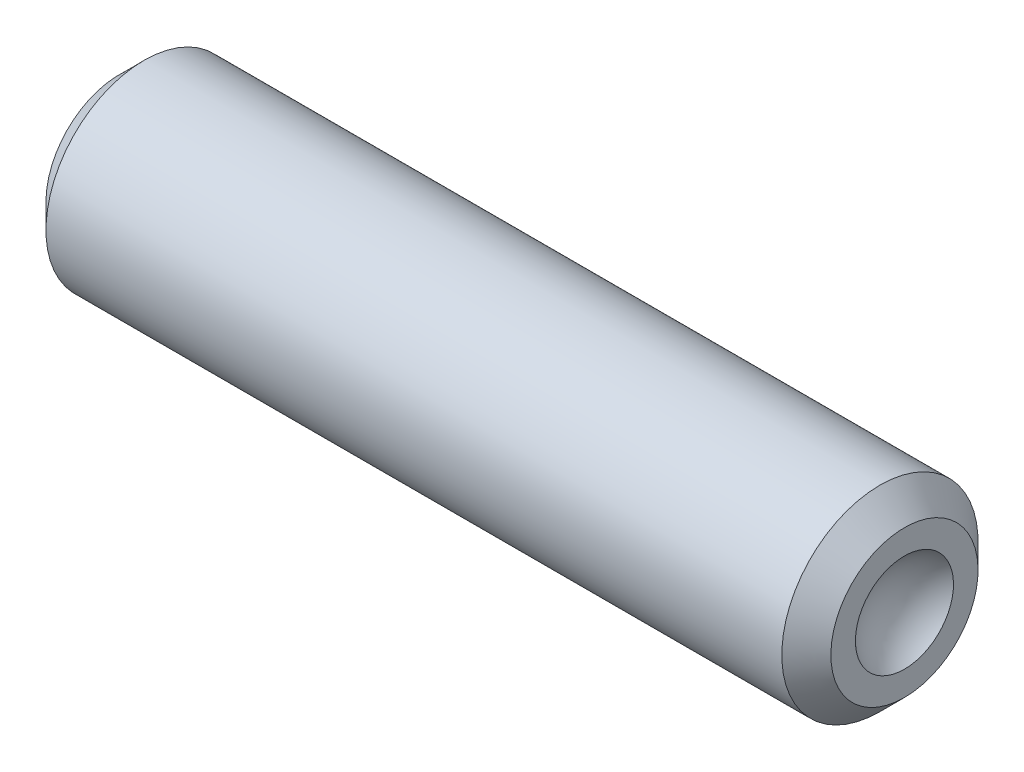
ISO-10303-21;
HEADER;
FILE_DESCRIPTION(('STEP AP214'),'2;1');
FILE_NAME('part.step','',(''),(''),'','','');
FILE_SCHEMA(('AUTOMOTIVE_DESIGN { 1 0 10303 214 1 1 1 1 }'));
ENDSEC;
DATA;
#1=APPLICATION_CONTEXT('core data for automotive mechanical design processes');
#2=APPLICATION_PROTOCOL_DEFINITION('international standard','automotive_design',2000,#1);
#3=PRODUCT_CONTEXT('',#1,'mechanical');
#4=PRODUCT('Part','Part','',(#3));
#5=PRODUCT_RELATED_PRODUCT_CATEGORY('part','',(#4));
#6=PRODUCT_DEFINITION_FORMATION('','',#4);
#7=PRODUCT_DEFINITION_CONTEXT('part definition',#1,'design');
#8=PRODUCT_DEFINITION('design','',#6,#7);
#9=PRODUCT_DEFINITION_SHAPE('','',#8);
#10=(LENGTH_UNIT() NAMED_UNIT(*) SI_UNIT(.MILLI.,.METRE.));
#11=(NAMED_UNIT(*) PLANE_ANGLE_UNIT() SI_UNIT($,.RADIAN.));
#12=(NAMED_UNIT(*) SI_UNIT($,.STERADIAN.) SOLID_ANGLE_UNIT());
#13=UNCERTAINTY_MEASURE_WITH_UNIT(LENGTH_MEASURE(1.E-05),#10,'distance_accuracy_value','');
#14=(GEOMETRIC_REPRESENTATION_CONTEXT(3) GLOBAL_UNCERTAINTY_ASSIGNED_CONTEXT((#13)) GLOBAL_UNIT_ASSIGNED_CONTEXT((#10,
#11,#12)) REPRESENTATION_CONTEXT('',''));
#15=CARTESIAN_POINT('',(0.,0.,0.));
#16=DIRECTION('',(0.,0.,1.));
#17=DIRECTION('',(1.,0.,0.));
#18=AXIS2_PLACEMENT_3D('',#15,#16,#17);
#19=CARTESIAN_POINT('',(0.,0.,0.));
#20=DIRECTION('',(1.,0.,0.));
#21=DIRECTION('',(0.,1.,0.));
#22=AXIS2_PLACEMENT_3D('',#19,#20,#21);
#23=PLANE('',#22);
#24=DIRECTION('',(0.,-0.5,-0.866025403784439));
#25=VECTOR('',#24,1.);
#26=CARTESIAN_POINT('',(0.,1.15470053837925,0.));
#27=LINE('',#26,#25);
#28=CARTESIAN_POINT('',(0.,1.15470053837925,0.));
#29=VERTEX_POINT('',#28);
#30=CARTESIAN_POINT('',(0.,0.577350269189626,-1.));
#31=VERTEX_POINT('',#30);
#32=EDGE_CURVE('E107',#29,#31,#27,.T.);
#33=ORIENTED_EDGE('',*,*,#32,.F.);
#34=DIRECTION('',(0.,0.5,-0.866025403784438));
#35=VECTOR('',#34,1.);
#36=CARTESIAN_POINT('',(0.,0.577350269189626,1.));
#37=LINE('',#36,#35);
#38=CARTESIAN_POINT('',(0.,0.577350269189626,1.));
#39=VERTEX_POINT('',#38);
#40=EDGE_CURVE('E49',#39,#29,#37,.T.);
#41=ORIENTED_EDGE('',*,*,#40,.F.);
#42=DIRECTION('',(0.,1.,0.));
#43=VECTOR('',#42,1.);
#44=CARTESIAN_POINT('',(0.,-0.577350269189626,1.));
#45=LINE('',#44,#43);
#46=CARTESIAN_POINT('',(0.,-0.577350269189626,1.));
#47=VERTEX_POINT('',#46);
#48=EDGE_CURVE('E122',#47,#39,#45,.T.);
#49=ORIENTED_EDGE('',*,*,#48,.F.);
#50=DIRECTION('',(0.,0.5,0.866025403784439));
#51=VECTOR('',#50,1.);
#52=CARTESIAN_POINT('',(0.,-1.15470053837925,0.));
#53=LINE('',#52,#51);
#54=CARTESIAN_POINT('',(0.,-1.15470053837925,0.));
#55=VERTEX_POINT('',#54);
#56=EDGE_CURVE('E116',#55,#47,#53,.T.);
#57=ORIENTED_EDGE('',*,*,#56,.F.);
#58=DIRECTION('',(0.,-0.5,0.866025403784438));
#59=VECTOR('',#58,1.);
#60=CARTESIAN_POINT('',(0.,-0.577350269189625,-1.));
#61=LINE('',#60,#59);
#62=CARTESIAN_POINT('',(0.,-0.577350269189625,-1.));
#63=VERTEX_POINT('',#62);
#64=EDGE_CURVE('E114',#63,#55,#61,.T.);
#65=ORIENTED_EDGE('',*,*,#64,.F.);
#66=DIRECTION('',(0.,-1.,0.));
#67=VECTOR('',#66,1.);
#68=CARTESIAN_POINT('',(0.,0.577350269189626,-1.));
#69=LINE('',#68,#67);
#70=EDGE_CURVE('E100',#31,#63,#69,.T.);
#71=ORIENTED_EDGE('',*,*,#70,.F.);
#72=EDGE_LOOP('',(#33,#41,#49,#57,#65,#71));
#73=FACE_BOUND('',#72,.T.);
#74=CARTESIAN_POINT('',(0.,0.,0.));
#75=DIRECTION('',(-1.,0.,0.));
#76=DIRECTION('',(0.,-1.,0.));
#77=AXIS2_PLACEMENT_3D('',#74,#75,#76);
#78=CIRCLE('',#77,1.5);
#79=CARTESIAN_POINT('',(0.,-1.5,0.));
#80=VERTEX_POINT('',#79);
#81=EDGE_CURVE('E12',#80,#80,#78,.T.);
#82=ORIENTED_EDGE('',*,*,#81,.T.);
#83=EDGE_LOOP('',(#82));
#84=FACE_BOUND('',#83,.T.);
#85=ADVANCED_FACE('F35',(#73,#84),#23,.F.);
#86=CARTESIAN_POINT('',(0.500000000000001,0.,0.));
#87=DIRECTION('',(1.,0.,0.));
#88=DIRECTION('',(0.,1.,0.));
#89=AXIS2_PLACEMENT_3D('',#86,#87,#88);
#90=CONICAL_SURFACE('',#89,2.,0.785398163397447);
#91=ORIENTED_EDGE('',*,*,#81,.F.);
#92=EDGE_LOOP('',(#91));
#93=FACE_BOUND('',#92,.T.);
#94=CARTESIAN_POINT('',(0.500000000000001,0.,0.));
#95=DIRECTION('',(-1.,0.,0.));
#96=DIRECTION('',(0.,-1.,0.));
#97=AXIS2_PLACEMENT_3D('',#94,#95,#96);
#98=CIRCLE('',#97,2.);
#99=CARTESIAN_POINT('',(0.500000000000001,-2.,0.));
#100=VERTEX_POINT('',#99);
#101=EDGE_CURVE('E42',#100,#100,#98,.T.);
#102=ORIENTED_EDGE('',*,*,#101,.T.);
#103=EDGE_LOOP('',(#102));
#104=FACE_BOUND('',#103,.T.);
#105=ADVANCED_FACE('F145',(#93,#104),#90,.T.);
#106=CARTESIAN_POINT('',(0.,0.,0.));
#107=DIRECTION('',(-1.,0.,0.));
#108=DIRECTION('',(0.,-1.,0.));
#109=AXIS2_PLACEMENT_3D('',#106,#107,#108);
#110=CYLINDRICAL_SURFACE('',#109,2.);
#111=ORIENTED_EDGE('',*,*,#101,.F.);
#112=EDGE_LOOP('',(#111));
#113=FACE_BOUND('',#112,.T.);
#114=CARTESIAN_POINT('',(15.5,0.,0.));
#115=DIRECTION('',(-1.,0.,0.));
#116=DIRECTION('',(0.,-1.,0.));
#117=AXIS2_PLACEMENT_3D('',#114,#115,#116);
#118=CIRCLE('',#117,2.);
#119=CARTESIAN_POINT('',(15.5,-2.,0.));
#120=VERTEX_POINT('',#119);
#121=EDGE_CURVE('E140',#120,#120,#118,.T.);
#122=ORIENTED_EDGE('',*,*,#121,.T.);
#123=EDGE_LOOP('',(#122));
#124=FACE_BOUND('',#123,.T.);
#125=ADVANCED_FACE('F147',(#113,#124),#110,.T.);
#126=CARTESIAN_POINT('',(16.,0.,0.));
#127=DIRECTION('',(-1.,0.,0.));
#128=DIRECTION('',(0.,-1.,0.));
#129=AXIS2_PLACEMENT_3D('',#126,#127,#128);
#130=CONICAL_SURFACE('',#129,1.5,0.785398163397447);
#131=ORIENTED_EDGE('',*,*,#121,.F.);
#132=EDGE_LOOP('',(#131));
#133=FACE_BOUND('',#132,.T.);
#134=CARTESIAN_POINT('',(16.,0.,0.));
#135=DIRECTION('',(-1.,0.,0.));
#136=DIRECTION('',(0.,-1.,0.));
#137=AXIS2_PLACEMENT_3D('',#134,#135,#136);
#138=CIRCLE('',#137,1.5);
#139=CARTESIAN_POINT('',(16.,-1.5,0.));
#140=VERTEX_POINT('',#139);
#141=EDGE_CURVE('E137',#140,#140,#138,.T.);
#142=ORIENTED_EDGE('',*,*,#141,.T.);
#143=EDGE_LOOP('',(#142));
#144=FACE_BOUND('',#143,.T.);
#145=ADVANCED_FACE('F150',(#133,#144),#130,.T.);
#146=CARTESIAN_POINT('',(16.,1.5,0.));
#147=DIRECTION('',(-1.,0.,0.));
#148=DIRECTION('',(0.,-1.,0.));
#149=AXIS2_PLACEMENT_3D('',#146,#147,#148);
#150=PLANE('',#149);
#151=ORIENTED_EDGE('',*,*,#141,.F.);
#152=EDGE_LOOP('',(#151));
#153=FACE_BOUND('',#152,.T.);
#154=CARTESIAN_POINT('',(16.,0.,0.));
#155=DIRECTION('',(-1.,0.,0.));
#156=DIRECTION('',(0.,-1.,0.));
#157=AXIS2_PLACEMENT_3D('',#154,#155,#156);
#158=CIRCLE('',#157,1.);
#159=CARTESIAN_POINT('',(16.,-1.,0.));
#160=VERTEX_POINT('',#159);
#161=EDGE_CURVE('E134',#160,#160,#158,.T.);
#162=ORIENTED_EDGE('',*,*,#161,.T.);
#163=EDGE_LOOP('',(#162));
#164=FACE_BOUND('',#163,.T.);
#165=ADVANCED_FACE('F156',(#153,#164),#150,.F.);
#166=CARTESIAN_POINT('',(16.75,0.,0.));
#167=DIRECTION('',(-1.,0.,0.));
#168=DIRECTION('',(0.,-1.,0.));
#169=AXIS2_PLACEMENT_3D('',#166,#167,#168);
#170=SPHERICAL_SURFACE('',#169,1.25);
#171=ORIENTED_EDGE('',*,*,#161,.F.);
#172=EDGE_LOOP('',(#171));
#173=FACE_BOUND('',#172,.T.);
#174=ADVANCED_FACE('F162',(#173),#170,.F.);
#175=CARTESIAN_POINT('',(19.0550504633039,0.577350269189626,1.));
#176=DIRECTION('',(0.,0.866025403784439,0.5));
#177=DIRECTION('',(0.,-0.5,0.866025403784439));
#178=AXIS2_PLACEMENT_3D('',#175,#176,#177);
#179=PLANE('',#178);
#180=DIRECTION('',(0.,-0.5,0.866025403784439));
#181=VECTOR('',#180,1.);
#182=CARTESIAN_POINT('',(14.,0.577350269189626,1.));
#183=LINE('',#182,#181);
#184=CARTESIAN_POINT('',(14.,1.15470053837925,0.));
#185=VERTEX_POINT('',#184);
#186=CARTESIAN_POINT('',(14.,0.577350269189626,1.));
#187=VERTEX_POINT('',#186);
#188=EDGE_CURVE('E68',#185,#187,#183,.T.);
#189=ORIENTED_EDGE('',*,*,#188,.T.);
#190=DIRECTION('',(-1.,0.,0.));
#191=VECTOR('',#190,1.);
#192=CARTESIAN_POINT('',(19.0550504633039,0.577350269189626,1.));
#193=LINE('',#192,#191);
#194=EDGE_CURVE('E125',#187,#39,#193,.T.);
#195=ORIENTED_EDGE('',*,*,#194,.T.);
#196=ORIENTED_EDGE('',*,*,#40,.T.);
#197=DIRECTION('',(-1.,0.,0.));
#198=VECTOR('',#197,1.);
#199=CARTESIAN_POINT('',(19.0550504633039,1.15470053837925,0.));
#200=LINE('',#199,#198);
#201=EDGE_CURVE('E104',#185,#29,#200,.T.);
#202=ORIENTED_EDGE('',*,*,#201,.F.);
#203=EDGE_LOOP('',(#189,#195,#196,#202));
#204=FACE_BOUND('',#203,.T.);
#205=ADVANCED_FACE('F167',(#204),#179,.F.);
#206=CARTESIAN_POINT('',(19.0550504633039,-0.577350269189626,1.));
#207=DIRECTION('',(0.,0.,1.));
#208=DIRECTION('',(1.,0.,0.));
#209=AXIS2_PLACEMENT_3D('',#206,#207,#208);
#210=PLANE('',#209);
#211=DIRECTION('',(0.,-1.,0.));
#212=VECTOR('',#211,1.);
#213=CARTESIAN_POINT('',(14.,-0.577350269189626,1.));
#214=LINE('',#213,#212);
#215=CARTESIAN_POINT('',(14.,-0.577350269189626,1.));
#216=VERTEX_POINT('',#215);
#217=EDGE_CURVE('E267',#187,#216,#214,.T.);
#218=ORIENTED_EDGE('',*,*,#217,.T.);
#219=DIRECTION('',(-1.,0.,0.));
#220=VECTOR('',#219,1.);
#221=CARTESIAN_POINT('',(19.0550504633039,-0.577350269189626,1.));
#222=LINE('',#221,#220);
#223=EDGE_CURVE('E127',#216,#47,#222,.T.);
#224=ORIENTED_EDGE('',*,*,#223,.T.);
#225=ORIENTED_EDGE('',*,*,#48,.T.);
#226=ORIENTED_EDGE('',*,*,#194,.F.);
#227=EDGE_LOOP('',(#218,#224,#225,#226));
#228=FACE_BOUND('',#227,.T.);
#229=ADVANCED_FACE('F172',(#228),#210,.F.);
#230=CARTESIAN_POINT('',(19.0550504633039,-1.15470053837925,0.));
#231=DIRECTION('',(0.,-0.866025403784439,0.5));
#232=DIRECTION('',(0.,-0.5,-0.866025403784439));
#233=AXIS2_PLACEMENT_3D('',#230,#231,#232);
#234=PLANE('',#233);
#235=DIRECTION('',(0.,-0.5,-0.866025403784439));
#236=VECTOR('',#235,1.);
#237=CARTESIAN_POINT('',(14.,-1.15470053837925,0.));
#238=LINE('',#237,#236);
#239=CARTESIAN_POINT('',(14.,-1.15470053837925,0.));
#240=VERTEX_POINT('',#239);
#241=EDGE_CURVE('E270',#216,#240,#238,.T.);
#242=ORIENTED_EDGE('',*,*,#241,.T.);
#243=DIRECTION('',(-1.,0.,0.));
#244=VECTOR('',#243,1.);
#245=CARTESIAN_POINT('',(19.0550504633039,-1.15470053837925,0.));
#246=LINE('',#245,#244);
#247=EDGE_CURVE('E129',#240,#55,#246,.T.);
#248=ORIENTED_EDGE('',*,*,#247,.T.);
#249=ORIENTED_EDGE('',*,*,#56,.T.);
#250=ORIENTED_EDGE('',*,*,#223,.F.);
#251=EDGE_LOOP('',(#242,#248,#249,#250));
#252=FACE_BOUND('',#251,.T.);
#253=ADVANCED_FACE('F217',(#252),#234,.F.);
#254=CARTESIAN_POINT('',(19.0550504633039,-0.577350269189626,-1.));
#255=DIRECTION('',(0.,-0.866025403784439,-0.5));
#256=DIRECTION('',(0.,0.5,-0.866025403784439));
#257=AXIS2_PLACEMENT_3D('',#254,#255,#256);
#258=PLANE('',#257);
#259=DIRECTION('',(0.,0.5,-0.866025403784439));
#260=VECTOR('',#259,1.);
#261=CARTESIAN_POINT('',(14.,-0.577350269189626,-1.));
#262=LINE('',#261,#260);
#263=CARTESIAN_POINT('',(14.,-0.577350269189626,-1.));
#264=VERTEX_POINT('',#263);
#265=EDGE_CURVE('E58',#240,#264,#262,.T.);
#266=ORIENTED_EDGE('',*,*,#265,.T.);
#267=DIRECTION('',(-1.,0.,0.));
#268=VECTOR('',#267,1.);
#269=CARTESIAN_POINT('',(19.0550504633039,-0.577350269189626,-1.));
#270=LINE('',#269,#268);
#271=EDGE_CURVE('E103',#264,#63,#270,.T.);
#272=ORIENTED_EDGE('',*,*,#271,.T.);
#273=ORIENTED_EDGE('',*,*,#64,.T.);
#274=ORIENTED_EDGE('',*,*,#247,.F.);
#275=EDGE_LOOP('',(#266,#272,#273,#274));
#276=FACE_BOUND('',#275,.T.);
#277=ADVANCED_FACE('F227',(#276),#258,.F.);
#278=CARTESIAN_POINT('',(19.0550504633039,0.577350269189626,-1.));
#279=DIRECTION('',(0.,0.,-1.));
#280=DIRECTION('',(-1.,0.,0.));
#281=AXIS2_PLACEMENT_3D('',#278,#279,#280);
#282=PLANE('',#281);
#283=DIRECTION('',(0.,1.,0.));
#284=VECTOR('',#283,1.);
#285=CARTESIAN_POINT('',(14.,0.577350269189626,-1.));
#286=LINE('',#285,#284);
#287=CARTESIAN_POINT('',(14.,0.577350269189626,-1.));
#288=VERTEX_POINT('',#287);
#289=EDGE_CURVE('E102',#264,#288,#286,.T.);
#290=ORIENTED_EDGE('',*,*,#289,.T.);
#291=DIRECTION('',(-1.,0.,0.));
#292=VECTOR('',#291,1.);
#293=CARTESIAN_POINT('',(19.0550504633039,0.577350269189626,-1.));
#294=LINE('',#293,#292);
#295=EDGE_CURVE('E95',#288,#31,#294,.T.);
#296=ORIENTED_EDGE('',*,*,#295,.T.);
#297=ORIENTED_EDGE('',*,*,#70,.T.);
#298=ORIENTED_EDGE('',*,*,#271,.F.);
#299=EDGE_LOOP('',(#290,#296,#297,#298));
#300=FACE_BOUND('',#299,.T.);
#301=ADVANCED_FACE('F97',(#300),#282,.F.);
#302=CARTESIAN_POINT('',(19.0550504633039,1.15470053837925,0.));
#303=DIRECTION('',(0.,0.866025403784439,-0.5));
#304=DIRECTION('',(0.,0.5,0.866025403784439));
#305=AXIS2_PLACEMENT_3D('',#302,#303,#304);
#306=PLANE('',#305);
#307=DIRECTION('',(0.,0.5,0.866025403784439));
#308=VECTOR('',#307,1.);
#309=CARTESIAN_POINT('',(14.,1.15470053837925,0.));
#310=LINE('',#309,#308);
#311=EDGE_CURVE('E77',#288,#185,#310,.T.);
#312=ORIENTED_EDGE('',*,*,#311,.T.);
#313=ORIENTED_EDGE('',*,*,#201,.T.);
#314=ORIENTED_EDGE('',*,*,#32,.T.);
#315=ORIENTED_EDGE('',*,*,#295,.F.);
#316=EDGE_LOOP('',(#312,#313,#314,#315));
#317=FACE_BOUND('',#316,.T.);
#318=ADVANCED_FACE('F108',(#317),#306,.F.);
#319=CARTESIAN_POINT('',(14.,1.5,0.));
#320=DIRECTION('',(-1.,0.,0.));
#321=DIRECTION('',(0.,-1.,0.));
#322=AXIS2_PLACEMENT_3D('',#319,#320,#321);
#323=PLANE('',#322);
#324=ORIENTED_EDGE('',*,*,#188,.F.);
#325=ORIENTED_EDGE('',*,*,#311,.F.);
#326=ORIENTED_EDGE('',*,*,#289,.F.);
#327=ORIENTED_EDGE('',*,*,#265,.F.);
#328=ORIENTED_EDGE('',*,*,#241,.F.);
#329=ORIENTED_EDGE('',*,*,#217,.F.);
#330=EDGE_LOOP('',(#324,#325,#326,#327,#328,#329));
#331=FACE_BOUND('',#330,.T.);
#332=ADVANCED_FACE('F253',(#331),#323,.T.);
#333=CLOSED_SHELL('',(#85,#105,#125,#145,#165,#174,#205,#229,#253,#277,#301,#318,#332));
#334=MANIFOLD_SOLID_BREP('B2',#333);
#335=ADVANCED_BREP_SHAPE_REPRESENTATION('',(#18,#334),#14);
#336=SHAPE_DEFINITION_REPRESENTATION(#9,#335);
ENDSEC;
END-ISO-10303-21;
